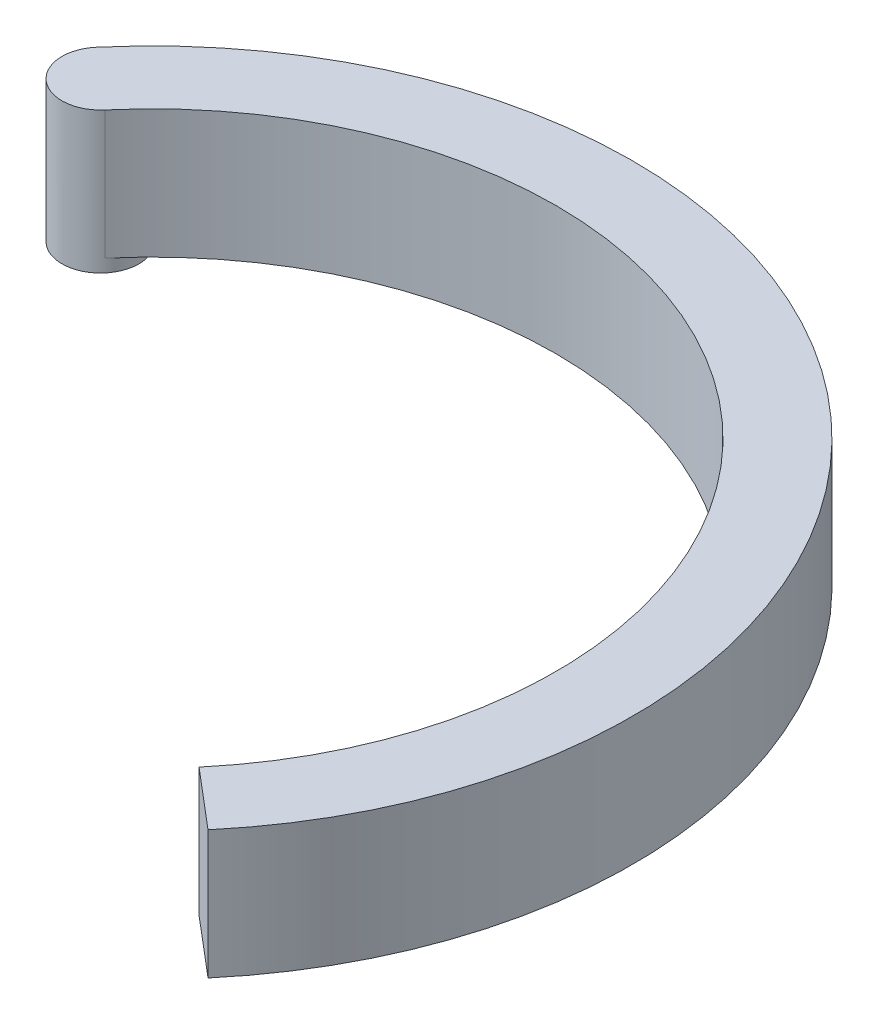
ISO-10303-21;
HEADER;
FILE_DESCRIPTION(('STEP AP214'),'2;1');
FILE_NAME('part.step','',(''),(''),'','','');
FILE_SCHEMA(('AUTOMOTIVE_DESIGN { 1 0 10303 214 1 1 1 1 }'));
ENDSEC;
DATA;
#1=APPLICATION_CONTEXT('core data for automotive mechanical design processes');
#2=APPLICATION_PROTOCOL_DEFINITION('international standard','automotive_design',2000,#1);
#3=PRODUCT_CONTEXT('',#1,'mechanical');
#4=PRODUCT('Part','Part','',(#3));
#5=PRODUCT_RELATED_PRODUCT_CATEGORY('part','',(#4));
#6=PRODUCT_DEFINITION_FORMATION('','',#4);
#7=PRODUCT_DEFINITION_CONTEXT('part definition',#1,'design');
#8=PRODUCT_DEFINITION('design','',#6,#7);
#9=PRODUCT_DEFINITION_SHAPE('','',#8);
#10=(LENGTH_UNIT() NAMED_UNIT(*) SI_UNIT(.MILLI.,.METRE.));
#11=(NAMED_UNIT(*) PLANE_ANGLE_UNIT() SI_UNIT($,.RADIAN.));
#12=(NAMED_UNIT(*) SI_UNIT($,.STERADIAN.) SOLID_ANGLE_UNIT());
#13=UNCERTAINTY_MEASURE_WITH_UNIT(LENGTH_MEASURE(1.E-05),#10,'distance_accuracy_value','');
#14=(GEOMETRIC_REPRESENTATION_CONTEXT(3) GLOBAL_UNCERTAINTY_ASSIGNED_CONTEXT((#13)) GLOBAL_UNIT_ASSIGNED_CONTEXT((#10,
#11,#12)) REPRESENTATION_CONTEXT('',''));
#15=CARTESIAN_POINT('',(0.,0.,0.));
#16=DIRECTION('',(0.,0.,1.));
#17=DIRECTION('',(1.,0.,0.));
#18=AXIS2_PLACEMENT_3D('',#15,#16,#17);
#19=CARTESIAN_POINT('',(39.4278833865222,10.,33.408862433757));
#20=DIRECTION('',(0.,1.,0.));
#21=DIRECTION('',(0.,0.,1.));
#22=AXIS2_PLACEMENT_3D('',#19,#20,#21);
#23=PLANE('',#22);
#24=CARTESIAN_POINT('',(26.2852555910148,10.,22.272574955838));
#25=DIRECTION('',(0.,-1.,0.));
#26=DIRECTION('',(0.,0.,1.));
#27=AXIS2_PLACEMENT_3D('',#24,#25,#26);
#28=CIRCLE('',#27,31.4526088511218);
#29=CARTESIAN_POINT('',(2.28881844953454,10.,1.93940973109612));
#30=VERTEX_POINT('',#29);
#31=CARTESIAN_POINT('',(50.2816927324951,10.,42.6057401805799));
#32=VERTEX_POINT('',#31);
#33=EDGE_CURVE('E99',#30,#32,#28,.T.);
#34=ORIENTED_EDGE('',*,*,#33,.T.);
#35=DIRECTION('',(0.762939483178178,0.,0.646469910365374));
#36=VECTOR('',#35,1.);
#37=CARTESIAN_POINT('',(39.4278833865222,10.,33.408862433757));
#38=LINE('',#37,#36);
#39=CARTESIAN_POINT('',(54.8593296315642,10.,46.4845596427721));
#40=VERTEX_POINT('',#39);
#41=EDGE_CURVE('E88',#32,#40,#38,.T.);
#42=ORIENTED_EDGE('',*,*,#41,.T.);
#43=CARTESIAN_POINT('',(26.2852555910148,10.,22.272574955838));
#44=DIRECTION('',(0.,1.,0.));
#45=DIRECTION('',(0.,0.,1.));
#46=AXIS2_PLACEMENT_3D('',#43,#44,#45);
#47=CIRCLE('',#46,37.4526088511218);
#48=CARTESIAN_POINT('',(-2.28881844953455,10.,-1.93940973109611));
#49=VERTEX_POINT('',#48);
#50=EDGE_CURVE('E122',#40,#49,#47,.T.);
#51=ORIENTED_EDGE('',*,*,#50,.T.);
#52=CARTESIAN_POINT('',(0.,10.,0.));
#53=DIRECTION('',(0.,1.,0.));
#54=DIRECTION('',(0.,0.,1.));
#55=AXIS2_PLACEMENT_3D('',#52,#53,#54);
#56=CIRCLE('',#55,3.);
#57=EDGE_CURVE('E61',#49,#30,#56,.T.);
#58=ORIENTED_EDGE('',*,*,#57,.T.);
#59=EDGE_LOOP('',(#34,#42,#51,#58));
#60=FACE_BOUND('',#59,.T.);
#61=ADVANCED_FACE('F43',(#60),#23,.T.);
#62=CARTESIAN_POINT('',(39.4278833865222,0.,33.408862433757));
#63=DIRECTION('',(0.,1.,0.));
#64=DIRECTION('',(0.,0.,1.));
#65=AXIS2_PLACEMENT_3D('',#62,#63,#64);
#66=PLANE('',#65);
#67=DIRECTION('',(0.762939483178178,0.,0.646469910365374));
#68=VECTOR('',#67,1.);
#69=CARTESIAN_POINT('',(39.4278833865222,0.,33.408862433757));
#70=LINE('',#69,#68);
#71=CARTESIAN_POINT('',(50.2816927324951,0.,42.6057401805799));
#72=VERTEX_POINT('',#71);
#73=CARTESIAN_POINT('',(54.8593296315642,0.,46.4845596427721));
#74=VERTEX_POINT('',#73);
#75=EDGE_CURVE('E11',#72,#74,#70,.T.);
#76=ORIENTED_EDGE('',*,*,#75,.F.);
#77=CARTESIAN_POINT('',(26.2852555910148,0.,22.272574955838));
#78=DIRECTION('',(0.,-1.,0.));
#79=DIRECTION('',(0.,0.,1.));
#80=AXIS2_PLACEMENT_3D('',#77,#78,#79);
#81=CIRCLE('',#80,31.4526088511218);
#82=CARTESIAN_POINT('',(2.28881844953454,0.,1.93940973109612));
#83=VERTEX_POINT('',#82);
#84=EDGE_CURVE('E77',#83,#72,#81,.T.);
#85=ORIENTED_EDGE('',*,*,#84,.F.);
#86=CARTESIAN_POINT('',(0.,0.,0.));
#87=DIRECTION('',(0.,-1.,0.));
#88=DIRECTION('',(0.,0.,-1.));
#89=AXIS2_PLACEMENT_3D('',#86,#87,#88);
#90=CIRCLE('',#89,3.);
#91=CARTESIAN_POINT('',(-2.28881844953455,0.,-1.93940973109611));
#92=VERTEX_POINT('',#91);
#93=EDGE_CURVE('E53',#92,#83,#90,.T.);
#94=ORIENTED_EDGE('',*,*,#93,.F.);
#95=CARTESIAN_POINT('',(26.2852555910148,0.,22.272574955838));
#96=DIRECTION('',(0.,1.,0.));
#97=DIRECTION('',(0.,0.,1.));
#98=AXIS2_PLACEMENT_3D('',#95,#96,#97);
#99=CIRCLE('',#98,37.4526088511218);
#100=EDGE_CURVE('E126',#74,#92,#99,.T.);
#101=ORIENTED_EDGE('',*,*,#100,.F.);
#102=EDGE_LOOP('',(#76,#85,#94,#101));
#103=FACE_BOUND('',#102,.T.);
#104=ADVANCED_FACE('F143',(#103),#66,.F.);
#105=CARTESIAN_POINT('',(26.2852555910148,10.,22.272574955838));
#106=DIRECTION('',(0.,-1.,0.));
#107=DIRECTION('',(0.,0.,-1.));
#108=AXIS2_PLACEMENT_3D('',#105,#106,#107);
#109=CYLINDRICAL_SURFACE('',#108,37.4526088511218);
#110=ORIENTED_EDGE('',*,*,#100,.T.);
#111=DIRECTION('',(0.,-1.,0.));
#112=VECTOR('',#111,1.);
#113=CARTESIAN_POINT('',(-2.28881844953455,10.,-1.93940973109611));
#114=LINE('',#113,#112);
#115=EDGE_CURVE('E108',#49,#92,#114,.T.);
#116=ORIENTED_EDGE('',*,*,#115,.F.);
#117=ORIENTED_EDGE('',*,*,#50,.F.);
#118=DIRECTION('',(0.,-1.,0.));
#119=VECTOR('',#118,1.);
#120=CARTESIAN_POINT('',(54.8593296315642,10.,46.4845596427721));
#121=LINE('',#120,#119);
#122=EDGE_CURVE('E93',#40,#74,#121,.T.);
#123=ORIENTED_EDGE('',*,*,#122,.T.);
#124=EDGE_LOOP('',(#110,#116,#117,#123));
#125=FACE_BOUND('',#124,.T.);
#126=ADVANCED_FACE('F45',(#125),#109,.T.);
#127=CARTESIAN_POINT('',(0.,10.,0.));
#128=DIRECTION('',(0.,-1.,0.));
#129=DIRECTION('',(0.,0.,-1.));
#130=AXIS2_PLACEMENT_3D('',#127,#128,#129);
#131=CYLINDRICAL_SURFACE('',#130,3.);
#132=ORIENTED_EDGE('',*,*,#115,.T.);
#133=ORIENTED_EDGE('',*,*,#93,.T.);
#134=DIRECTION('',(0.,-1.,0.));
#135=VECTOR('',#134,1.);
#136=CARTESIAN_POINT('',(2.28881844953454,10.,1.93940973109612));
#137=LINE('',#136,#135);
#138=EDGE_CURVE('E105',#30,#83,#137,.T.);
#139=ORIENTED_EDGE('',*,*,#138,.F.);
#140=ORIENTED_EDGE('',*,*,#57,.F.);
#141=EDGE_LOOP('',(#132,#133,#139,#140));
#142=FACE_BOUND('',#141,.T.);
#143=CARTESIAN_POINT('',(0.,-1.,0.));
#144=DIRECTION('',(0.,-1.,0.));
#145=DIRECTION('',(0.,0.,-1.));
#146=AXIS2_PLACEMENT_3D('',#143,#144,#145);
#147=CIRCLE('',#146,3.);
#148=CARTESIAN_POINT('',(0.,-1.,-3.));
#149=VERTEX_POINT('',#148);
#150=EDGE_CURVE('E96',#149,#149,#147,.T.);
#151=ORIENTED_EDGE('',*,*,#150,.F.);
#152=EDGE_LOOP('',(#151));
#153=FACE_BOUND('',#152,.T.);
#154=ADVANCED_FACE('F136',(#142,#153),#131,.T.);
#155=CARTESIAN_POINT('',(26.2852555910148,10.,22.272574955838));
#156=DIRECTION('',(0.,-1.,0.));
#157=DIRECTION('',(0.,0.,-1.));
#158=AXIS2_PLACEMENT_3D('',#155,#156,#157);
#159=CYLINDRICAL_SURFACE('',#158,31.4526088511218);
#160=ORIENTED_EDGE('',*,*,#84,.T.);
#161=DIRECTION('',(0.,-1.,0.));
#162=VECTOR('',#161,1.);
#163=CARTESIAN_POINT('',(50.2816927324951,10.,42.6057401805799));
#164=LINE('',#163,#162);
#165=EDGE_CURVE('E91',#32,#72,#164,.T.);
#166=ORIENTED_EDGE('',*,*,#165,.F.);
#167=ORIENTED_EDGE('',*,*,#33,.F.);
#168=ORIENTED_EDGE('',*,*,#138,.T.);
#169=EDGE_LOOP('',(#160,#166,#167,#168));
#170=FACE_BOUND('',#169,.T.);
#171=ADVANCED_FACE('F103',(#170),#159,.F.);
#172=CARTESIAN_POINT('',(0.,-1.,0.));
#173=DIRECTION('',(0.,-1.,0.));
#174=DIRECTION('',(0.,0.,-1.));
#175=AXIS2_PLACEMENT_3D('',#172,#173,#174);
#176=PLANE('',#175);
#177=ORIENTED_EDGE('',*,*,#150,.T.);
#178=EDGE_LOOP('',(#177));
#179=FACE_BOUND('',#178,.T.);
#180=ADVANCED_FACE('F134',(#179),#176,.T.);
#181=CARTESIAN_POINT('',(54.8593296315642,-59.,46.4845596427721));
#182=DIRECTION('',(-0.646469910365374,0.,0.762939483178178));
#183=DIRECTION('',(0.762939483178178,0.,0.646469910365374));
#184=AXIS2_PLACEMENT_3D('',#181,#182,#183);
#185=PLANE('',#184);
#186=ORIENTED_EDGE('',*,*,#165,.T.);
#187=ORIENTED_EDGE('',*,*,#75,.T.);
#188=ORIENTED_EDGE('',*,*,#122,.F.);
#189=ORIENTED_EDGE('',*,*,#41,.F.);
#190=EDGE_LOOP('',(#186,#187,#188,#189));
#191=FACE_BOUND('',#190,.T.);
#192=ADVANCED_FACE('F89',(#191),#185,.T.);
#193=CLOSED_SHELL('',(#61,#104,#126,#154,#171,#180,#192));
#194=MANIFOLD_SOLID_BREP('B2',#193);
#195=ADVANCED_BREP_SHAPE_REPRESENTATION('',(#18,#194),#14);
#196=SHAPE_DEFINITION_REPRESENTATION(#9,#195);
ENDSEC;
END-ISO-10303-21;
